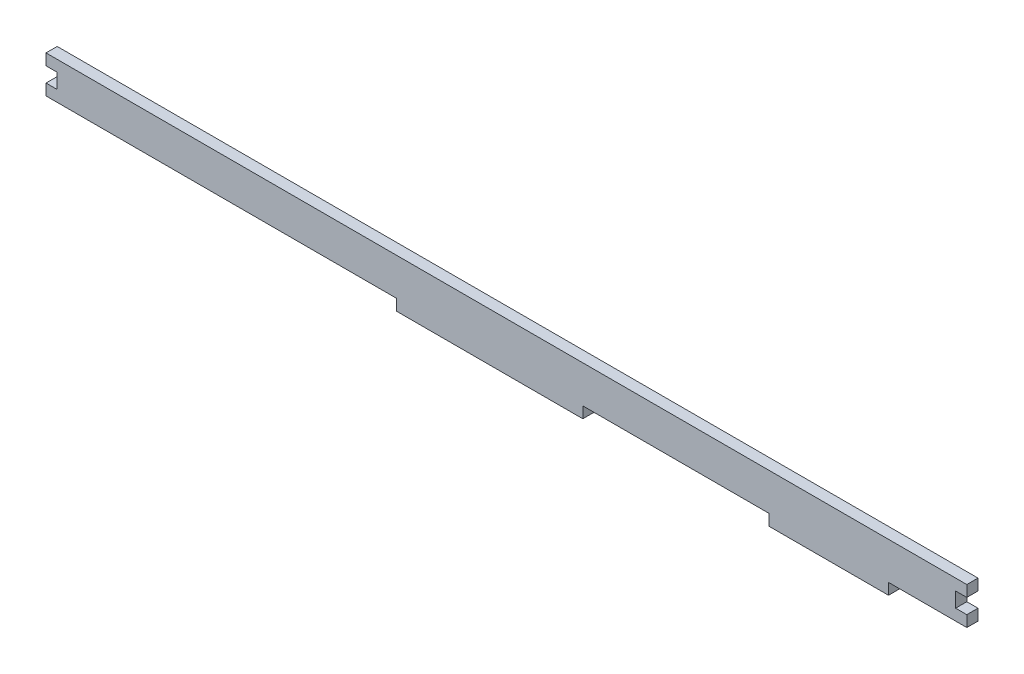
ISO-10303-21;
HEADER;
FILE_DESCRIPTION(('STEP AP214'),'2;1');
FILE_NAME('part.step','',(''),(''),'','','');
FILE_SCHEMA(('AUTOMOTIVE_DESIGN { 1 0 10303 214 1 1 1 1 }'));
ENDSEC;
DATA;
#1=APPLICATION_CONTEXT('core data for automotive mechanical design processes');
#2=APPLICATION_PROTOCOL_DEFINITION('international standard','automotive_design',2000,#1);
#3=PRODUCT_CONTEXT('',#1,'mechanical');
#4=PRODUCT('Part','Part','',(#3));
#5=PRODUCT_RELATED_PRODUCT_CATEGORY('part','',(#4));
#6=PRODUCT_DEFINITION_FORMATION('','',#4);
#7=PRODUCT_DEFINITION_CONTEXT('part definition',#1,'design');
#8=PRODUCT_DEFINITION('design','',#6,#7);
#9=PRODUCT_DEFINITION_SHAPE('','',#8);
#10=(LENGTH_UNIT() NAMED_UNIT(*) SI_UNIT(.MILLI.,.METRE.));
#11=(NAMED_UNIT(*) PLANE_ANGLE_UNIT() SI_UNIT($,.RADIAN.));
#12=(NAMED_UNIT(*) SI_UNIT($,.STERADIAN.) SOLID_ANGLE_UNIT());
#13=UNCERTAINTY_MEASURE_WITH_UNIT(LENGTH_MEASURE(1.E-05),#10,'distance_accuracy_value','');
#14=(GEOMETRIC_REPRESENTATION_CONTEXT(3) GLOBAL_UNCERTAINTY_ASSIGNED_CONTEXT((#13)) GLOBAL_UNIT_ASSIGNED_CONTEXT((#10,
#11,#12)) REPRESENTATION_CONTEXT('',''));
#15=CARTESIAN_POINT('',(0.,0.,0.));
#16=DIRECTION('',(0.,0.,1.));
#17=DIRECTION('',(1.,0.,0.));
#18=AXIS2_PLACEMENT_3D('',#15,#16,#17);
#19=CARTESIAN_POINT('',(247.,10.,3.));
#20=DIRECTION('',(-1.,0.,0.));
#21=DIRECTION('',(0.,0.,1.));
#22=AXIS2_PLACEMENT_3D('',#19,#20,#21);
#23=PLANE('',#22);
#24=DIRECTION('',(0.,1.,0.));
#25=VECTOR('',#24,1.);
#26=CARTESIAN_POINT('',(247.,10.,0.));
#27=LINE('',#26,#25);
#28=CARTESIAN_POINT('',(247.,7.,0.));
#29=VERTEX_POINT('',#28);
#30=CARTESIAN_POINT('',(247.,10.,0.));
#31=VERTEX_POINT('',#30);
#32=EDGE_CURVE('E202',#29,#31,#27,.T.);
#33=ORIENTED_EDGE('',*,*,#32,.T.);
#34=DIRECTION('',(0.,0.,-1.));
#35=VECTOR('',#34,1.);
#36=CARTESIAN_POINT('',(247.,10.,3.));
#37=LINE('',#36,#35);
#38=CARTESIAN_POINT('',(247.,10.,3.));
#39=VERTEX_POINT('',#38);
#40=EDGE_CURVE('E11',#39,#31,#37,.T.);
#41=ORIENTED_EDGE('',*,*,#40,.F.);
#42=DIRECTION('',(0.,1.,0.));
#43=VECTOR('',#42,1.);
#44=CARTESIAN_POINT('',(247.,10.,3.));
#45=LINE('',#44,#43);
#46=CARTESIAN_POINT('',(247.,7.,3.));
#47=VERTEX_POINT('',#46);
#48=EDGE_CURVE('E240',#47,#39,#45,.T.);
#49=ORIENTED_EDGE('',*,*,#48,.F.);
#50=DIRECTION('',(0.,0.,-1.));
#51=VECTOR('',#50,1.);
#52=CARTESIAN_POINT('',(247.,7.,3.));
#53=LINE('',#52,#51);
#54=EDGE_CURVE('E198',#47,#29,#53,.T.);
#55=ORIENTED_EDGE('',*,*,#54,.T.);
#56=EDGE_LOOP('',(#33,#41,#49,#55));
#57=FACE_BOUND('',#56,.T.);
#58=ADVANCED_FACE('F34',(#57),#23,.F.);
#59=CARTESIAN_POINT('',(0.,10.,3.));
#60=DIRECTION('',(0.,-1.,0.));
#61=DIRECTION('',(0.,0.,-1.));
#62=AXIS2_PLACEMENT_3D('',#59,#60,#61);
#63=PLANE('',#62);
#64=DIRECTION('',(-1.,0.,0.));
#65=VECTOR('',#64,1.);
#66=CARTESIAN_POINT('',(0.,10.,0.));
#67=LINE('',#66,#65);
#68=CARTESIAN_POINT('',(0.,10.,0.));
#69=VERTEX_POINT('',#68);
#70=EDGE_CURVE('E205',#31,#69,#67,.T.);
#71=ORIENTED_EDGE('',*,*,#70,.T.);
#72=DIRECTION('',(0.,0.,-1.));
#73=VECTOR('',#72,1.);
#74=CARTESIAN_POINT('',(0.,10.,3.));
#75=LINE('',#74,#73);
#76=CARTESIAN_POINT('',(0.,10.,3.));
#77=VERTEX_POINT('',#76);
#78=EDGE_CURVE('E42',#77,#69,#75,.T.);
#79=ORIENTED_EDGE('',*,*,#78,.F.);
#80=DIRECTION('',(-1.,0.,0.));
#81=VECTOR('',#80,1.);
#82=CARTESIAN_POINT('',(244.,10.,3.));
#83=LINE('',#82,#81);
#84=EDGE_CURVE('E129',#39,#77,#83,.T.);
#85=ORIENTED_EDGE('',*,*,#84,.F.);
#86=ORIENTED_EDGE('',*,*,#40,.T.);
#87=EDGE_LOOP('',(#71,#79,#85,#86));
#88=FACE_BOUND('',#87,.T.);
#89=ADVANCED_FACE('F358',(#88),#63,.F.);
#90=CARTESIAN_POINT('',(0.,10.,3.));
#91=DIRECTION('',(1.,0.,0.));
#92=DIRECTION('',(0.,1.,0.));
#93=AXIS2_PLACEMENT_3D('',#90,#91,#92);
#94=PLANE('',#93);
#95=DIRECTION('',(0.,-1.,0.));
#96=VECTOR('',#95,1.);
#97=CARTESIAN_POINT('',(0.,10.,0.));
#98=LINE('',#97,#96);
#99=CARTESIAN_POINT('',(0.,7.,0.));
#100=VERTEX_POINT('',#99);
#101=EDGE_CURVE('E207',#69,#100,#98,.T.);
#102=ORIENTED_EDGE('',*,*,#101,.T.);
#103=DIRECTION('',(0.,0.,-1.));
#104=VECTOR('',#103,1.);
#105=CARTESIAN_POINT('',(0.,7.,3.));
#106=LINE('',#105,#104);
#107=CARTESIAN_POINT('',(0.,7.,3.));
#108=VERTEX_POINT('',#107);
#109=EDGE_CURVE('E283',#108,#100,#106,.T.);
#110=ORIENTED_EDGE('',*,*,#109,.F.);
#111=DIRECTION('',(0.,-1.,0.));
#112=VECTOR('',#111,1.);
#113=CARTESIAN_POINT('',(0.,10.,3.));
#114=LINE('',#113,#112);
#115=EDGE_CURVE('E291',#77,#108,#114,.T.);
#116=ORIENTED_EDGE('',*,*,#115,.F.);
#117=ORIENTED_EDGE('',*,*,#78,.T.);
#118=EDGE_LOOP('',(#102,#110,#116,#117));
#119=FACE_BOUND('',#118,.T.);
#120=ADVANCED_FACE('F289',(#119),#94,.F.);
#121=CARTESIAN_POINT('',(0.,7.,3.));
#122=DIRECTION('',(0.,1.,0.));
#123=DIRECTION('',(0.,0.,1.));
#124=AXIS2_PLACEMENT_3D('',#121,#122,#123);
#125=PLANE('',#124);
#126=DIRECTION('',(1.,0.,0.));
#127=VECTOR('',#126,1.);
#128=CARTESIAN_POINT('',(0.,7.,0.));
#129=LINE('',#128,#127);
#130=CARTESIAN_POINT('',(3.,7.,0.));
#131=VERTEX_POINT('',#130);
#132=EDGE_CURVE('E209',#100,#131,#129,.T.);
#133=ORIENTED_EDGE('',*,*,#132,.T.);
#134=DIRECTION('',(0.,0.,-1.));
#135=VECTOR('',#134,1.);
#136=CARTESIAN_POINT('',(3.,7.,3.));
#137=LINE('',#136,#135);
#138=CARTESIAN_POINT('',(3.,7.,3.));
#139=VERTEX_POINT('',#138);
#140=EDGE_CURVE('E280',#139,#131,#137,.T.);
#141=ORIENTED_EDGE('',*,*,#140,.F.);
#142=DIRECTION('',(1.,0.,0.));
#143=VECTOR('',#142,1.);
#144=CARTESIAN_POINT('',(0.,7.,3.));
#145=LINE('',#144,#143);
#146=EDGE_CURVE('E309',#108,#139,#145,.T.);
#147=ORIENTED_EDGE('',*,*,#146,.F.);
#148=ORIENTED_EDGE('',*,*,#109,.T.);
#149=EDGE_LOOP('',(#133,#141,#147,#148));
#150=FACE_BOUND('',#149,.T.);
#151=ADVANCED_FACE('F300',(#150),#125,.F.);
#152=CARTESIAN_POINT('',(3.,7.,3.));
#153=DIRECTION('',(1.,0.,0.));
#154=DIRECTION('',(0.,1.,0.));
#155=AXIS2_PLACEMENT_3D('',#152,#153,#154);
#156=PLANE('',#155);
#157=DIRECTION('',(0.,-1.,0.));
#158=VECTOR('',#157,1.);
#159=CARTESIAN_POINT('',(3.,7.,0.));
#160=LINE('',#159,#158);
#161=CARTESIAN_POINT('',(3.,3.,0.));
#162=VERTEX_POINT('',#161);
#163=EDGE_CURVE('E211',#131,#162,#160,.T.);
#164=ORIENTED_EDGE('',*,*,#163,.T.);
#165=DIRECTION('',(0.,0.,-1.));
#166=VECTOR('',#165,1.);
#167=CARTESIAN_POINT('',(3.,3.,3.));
#168=LINE('',#167,#166);
#169=CARTESIAN_POINT('',(3.,3.,3.));
#170=VERTEX_POINT('',#169);
#171=EDGE_CURVE('E277',#170,#162,#168,.T.);
#172=ORIENTED_EDGE('',*,*,#171,.F.);
#173=DIRECTION('',(0.,-1.,0.));
#174=VECTOR('',#173,1.);
#175=CARTESIAN_POINT('',(3.,7.,3.));
#176=LINE('',#175,#174);
#177=EDGE_CURVE('E306',#139,#170,#176,.T.);
#178=ORIENTED_EDGE('',*,*,#177,.F.);
#179=ORIENTED_EDGE('',*,*,#140,.T.);
#180=EDGE_LOOP('',(#164,#172,#178,#179));
#181=FACE_BOUND('',#180,.T.);
#182=ADVANCED_FACE('F304',(#181),#156,.F.);
#183=CARTESIAN_POINT('',(0.,3.,3.));
#184=DIRECTION('',(0.,-1.,0.));
#185=DIRECTION('',(0.,0.,-1.));
#186=AXIS2_PLACEMENT_3D('',#183,#184,#185);
#187=PLANE('',#186);
#188=DIRECTION('',(-1.,0.,0.));
#189=VECTOR('',#188,1.);
#190=CARTESIAN_POINT('',(0.,3.,0.));
#191=LINE('',#190,#189);
#192=CARTESIAN_POINT('',(0.,3.,0.));
#193=VERTEX_POINT('',#192);
#194=EDGE_CURVE('E213',#162,#193,#191,.T.);
#195=ORIENTED_EDGE('',*,*,#194,.T.);
#196=DIRECTION('',(0.,0.,-1.));
#197=VECTOR('',#196,1.);
#198=CARTESIAN_POINT('',(0.,3.,3.));
#199=LINE('',#198,#197);
#200=CARTESIAN_POINT('',(0.,3.,3.));
#201=VERTEX_POINT('',#200);
#202=EDGE_CURVE('E274',#201,#193,#199,.T.);
#203=ORIENTED_EDGE('',*,*,#202,.F.);
#204=DIRECTION('',(-1.,0.,0.));
#205=VECTOR('',#204,1.);
#206=CARTESIAN_POINT('',(0.,3.,3.));
#207=LINE('',#206,#205);
#208=EDGE_CURVE('E308',#170,#201,#207,.T.);
#209=ORIENTED_EDGE('',*,*,#208,.F.);
#210=ORIENTED_EDGE('',*,*,#171,.T.);
#211=EDGE_LOOP('',(#195,#203,#209,#210));
#212=FACE_BOUND('',#211,.T.);
#213=ADVANCED_FACE('F371',(#212),#187,.F.);
#214=CARTESIAN_POINT('',(0.,3.,3.));
#215=DIRECTION('',(1.,0.,0.));
#216=DIRECTION('',(0.,1.,0.));
#217=AXIS2_PLACEMENT_3D('',#214,#215,#216);
#218=PLANE('',#217);
#219=DIRECTION('',(0.,-1.,0.));
#220=VECTOR('',#219,1.);
#221=CARTESIAN_POINT('',(0.,3.,0.));
#222=LINE('',#221,#220);
#223=CARTESIAN_POINT('',(0.,0.,0.));
#224=VERTEX_POINT('',#223);
#225=EDGE_CURVE('E215',#193,#224,#222,.T.);
#226=ORIENTED_EDGE('',*,*,#225,.T.);
#227=DIRECTION('',(0.,0.,-1.));
#228=VECTOR('',#227,1.);
#229=CARTESIAN_POINT('',(0.,0.,3.));
#230=LINE('',#229,#228);
#231=CARTESIAN_POINT('',(0.,0.,3.));
#232=VERTEX_POINT('',#231);
#233=EDGE_CURVE('E271',#232,#224,#230,.T.);
#234=ORIENTED_EDGE('',*,*,#233,.F.);
#235=DIRECTION('',(0.,-1.,0.));
#236=VECTOR('',#235,1.);
#237=CARTESIAN_POINT('',(0.,3.,3.));
#238=LINE('',#237,#236);
#239=EDGE_CURVE('E311',#201,#232,#238,.T.);
#240=ORIENTED_EDGE('',*,*,#239,.F.);
#241=ORIENTED_EDGE('',*,*,#202,.T.);
#242=EDGE_LOOP('',(#226,#234,#240,#241));
#243=FACE_BOUND('',#242,.T.);
#244=ADVANCED_FACE('F374',(#243),#218,.F.);
#245=CARTESIAN_POINT('',(0.,0.,3.));
#246=DIRECTION('',(0.,1.,0.));
#247=DIRECTION('',(0.,0.,1.));
#248=AXIS2_PLACEMENT_3D('',#245,#246,#247);
#249=PLANE('',#248);
#250=DIRECTION('',(1.,0.,0.));
#251=VECTOR('',#250,1.);
#252=CARTESIAN_POINT('',(0.,0.,0.));
#253=LINE('',#252,#251);
#254=CARTESIAN_POINT('',(94.,0.,0.));
#255=VERTEX_POINT('',#254);
#256=EDGE_CURVE('E217',#224,#255,#253,.T.);
#257=ORIENTED_EDGE('',*,*,#256,.T.);
#258=DIRECTION('',(0.,0.,-1.));
#259=VECTOR('',#258,1.);
#260=CARTESIAN_POINT('',(94.,0.,3.));
#261=LINE('',#260,#259);
#262=CARTESIAN_POINT('',(94.,0.,3.));
#263=VERTEX_POINT('',#262);
#264=EDGE_CURVE('E268',#263,#255,#261,.T.);
#265=ORIENTED_EDGE('',*,*,#264,.F.);
#266=DIRECTION('',(1.,0.,0.));
#267=VECTOR('',#266,1.);
#268=CARTESIAN_POINT('',(0.,0.,3.));
#269=LINE('',#268,#267);
#270=EDGE_CURVE('E317',#232,#263,#269,.T.);
#271=ORIENTED_EDGE('',*,*,#270,.F.);
#272=ORIENTED_EDGE('',*,*,#233,.T.);
#273=EDGE_LOOP('',(#257,#265,#271,#272));
#274=FACE_BOUND('',#273,.T.);
#275=ADVANCED_FACE('F378',(#274),#249,.F.);
#276=CARTESIAN_POINT('',(94.,0.,3.));
#277=DIRECTION('',(1.,0.,0.));
#278=DIRECTION('',(0.,0.,-1.));
#279=AXIS2_PLACEMENT_3D('',#276,#277,#278);
#280=PLANE('',#279);
#281=DIRECTION('',(0.,-1.,0.));
#282=VECTOR('',#281,1.);
#283=CARTESIAN_POINT('',(94.,0.,0.));
#284=LINE('',#283,#282);
#285=CARTESIAN_POINT('',(94.,-3.,0.));
#286=VERTEX_POINT('',#285);
#287=EDGE_CURVE('E219',#255,#286,#284,.T.);
#288=ORIENTED_EDGE('',*,*,#287,.T.);
#289=DIRECTION('',(0.,0.,-1.));
#290=VECTOR('',#289,1.);
#291=CARTESIAN_POINT('',(94.,-3.,3.));
#292=LINE('',#291,#290);
#293=CARTESIAN_POINT('',(94.,-3.,3.));
#294=VERTEX_POINT('',#293);
#295=EDGE_CURVE('E265',#294,#286,#292,.T.);
#296=ORIENTED_EDGE('',*,*,#295,.F.);
#297=DIRECTION('',(0.,-1.,0.));
#298=VECTOR('',#297,1.);
#299=CARTESIAN_POINT('',(94.,0.,3.));
#300=LINE('',#299,#298);
#301=EDGE_CURVE('E319',#263,#294,#300,.T.);
#302=ORIENTED_EDGE('',*,*,#301,.F.);
#303=ORIENTED_EDGE('',*,*,#264,.T.);
#304=EDGE_LOOP('',(#288,#296,#302,#303));
#305=FACE_BOUND('',#304,.T.);
#306=ADVANCED_FACE('F382',(#305),#280,.F.);
#307=CARTESIAN_POINT('',(94.,-3.,3.));
#308=DIRECTION('',(0.,1.,0.));
#309=DIRECTION('',(0.,0.,1.));
#310=AXIS2_PLACEMENT_3D('',#307,#308,#309);
#311=PLANE('',#310);
#312=DIRECTION('',(1.,0.,0.));
#313=VECTOR('',#312,1.);
#314=CARTESIAN_POINT('',(94.,-3.,0.));
#315=LINE('',#314,#313);
#316=CARTESIAN_POINT('',(144.,-3.,0.));
#317=VERTEX_POINT('',#316);
#318=EDGE_CURVE('E221',#286,#317,#315,.T.);
#319=ORIENTED_EDGE('',*,*,#318,.T.);
#320=DIRECTION('',(0.,0.,-1.));
#321=VECTOR('',#320,1.);
#322=CARTESIAN_POINT('',(144.,-3.,3.));
#323=LINE('',#322,#321);
#324=CARTESIAN_POINT('',(144.,-3.,3.));
#325=VERTEX_POINT('',#324);
#326=EDGE_CURVE('E262',#325,#317,#323,.T.);
#327=ORIENTED_EDGE('',*,*,#326,.F.);
#328=DIRECTION('',(1.,0.,0.));
#329=VECTOR('',#328,1.);
#330=CARTESIAN_POINT('',(94.,-3.,3.));
#331=LINE('',#330,#329);
#332=EDGE_CURVE('E321',#294,#325,#331,.T.);
#333=ORIENTED_EDGE('',*,*,#332,.F.);
#334=ORIENTED_EDGE('',*,*,#295,.T.);
#335=EDGE_LOOP('',(#319,#327,#333,#334));
#336=FACE_BOUND('',#335,.T.);
#337=ADVANCED_FACE('F386',(#336),#311,.F.);
#338=CARTESIAN_POINT('',(144.,0.,3.));
#339=DIRECTION('',(-1.,0.,0.));
#340=DIRECTION('',(0.,0.,1.));
#341=AXIS2_PLACEMENT_3D('',#338,#339,#340);
#342=PLANE('',#341);
#343=DIRECTION('',(0.,1.,0.));
#344=VECTOR('',#343,1.);
#345=CARTESIAN_POINT('',(144.,0.,0.));
#346=LINE('',#345,#344);
#347=CARTESIAN_POINT('',(144.,0.,0.));
#348=VERTEX_POINT('',#347);
#349=EDGE_CURVE('E223',#317,#348,#346,.T.);
#350=ORIENTED_EDGE('',*,*,#349,.T.);
#351=DIRECTION('',(0.,0.,-1.));
#352=VECTOR('',#351,1.);
#353=CARTESIAN_POINT('',(144.,0.,3.));
#354=LINE('',#353,#352);
#355=CARTESIAN_POINT('',(144.,0.,3.));
#356=VERTEX_POINT('',#355);
#357=EDGE_CURVE('E259',#356,#348,#354,.T.);
#358=ORIENTED_EDGE('',*,*,#357,.F.);
#359=DIRECTION('',(0.,1.,0.));
#360=VECTOR('',#359,1.);
#361=CARTESIAN_POINT('',(144.,0.,3.));
#362=LINE('',#361,#360);
#363=EDGE_CURVE('E323',#325,#356,#362,.T.);
#364=ORIENTED_EDGE('',*,*,#363,.F.);
#365=ORIENTED_EDGE('',*,*,#326,.T.);
#366=EDGE_LOOP('',(#350,#358,#364,#365));
#367=FACE_BOUND('',#366,.T.);
#368=ADVANCED_FACE('F390',(#367),#342,.F.);
#369=CARTESIAN_POINT('',(144.,0.,3.));
#370=DIRECTION('',(0.,1.,0.));
#371=DIRECTION('',(-1.,0.,0.));
#372=AXIS2_PLACEMENT_3D('',#369,#370,#371);
#373=PLANE('',#372);
#374=DIRECTION('',(1.,0.,0.));
#375=VECTOR('',#374,1.);
#376=CARTESIAN_POINT('',(144.,0.,0.));
#377=LINE('',#376,#375);
#378=CARTESIAN_POINT('',(194.,0.,0.));
#379=VERTEX_POINT('',#378);
#380=EDGE_CURVE('E225',#348,#379,#377,.T.);
#381=ORIENTED_EDGE('',*,*,#380,.T.);
#382=DIRECTION('',(0.,0.,-1.));
#383=VECTOR('',#382,1.);
#384=CARTESIAN_POINT('',(194.,0.,3.));
#385=LINE('',#384,#383);
#386=CARTESIAN_POINT('',(194.,0.,3.));
#387=VERTEX_POINT('',#386);
#388=EDGE_CURVE('E256',#387,#379,#385,.T.);
#389=ORIENTED_EDGE('',*,*,#388,.F.);
#390=DIRECTION('',(1.,0.,0.));
#391=VECTOR('',#390,1.);
#392=CARTESIAN_POINT('',(144.,0.,3.));
#393=LINE('',#392,#391);
#394=EDGE_CURVE('E325',#356,#387,#393,.T.);
#395=ORIENTED_EDGE('',*,*,#394,.F.);
#396=ORIENTED_EDGE('',*,*,#357,.T.);
#397=EDGE_LOOP('',(#381,#389,#395,#396));
#398=FACE_BOUND('',#397,.T.);
#399=ADVANCED_FACE('F394',(#398),#373,.F.);
#400=CARTESIAN_POINT('',(194.,0.,3.));
#401=DIRECTION('',(1.,0.,0.));
#402=DIRECTION('',(0.,0.,-1.));
#403=AXIS2_PLACEMENT_3D('',#400,#401,#402);
#404=PLANE('',#403);
#405=DIRECTION('',(0.,-1.,0.));
#406=VECTOR('',#405,1.);
#407=CARTESIAN_POINT('',(194.,0.,0.));
#408=LINE('',#407,#406);
#409=CARTESIAN_POINT('',(194.,-3.00000000000001,0.));
#410=VERTEX_POINT('',#409);
#411=EDGE_CURVE('E227',#379,#410,#408,.T.);
#412=ORIENTED_EDGE('',*,*,#411,.T.);
#413=DIRECTION('',(0.,0.,-1.));
#414=VECTOR('',#413,1.);
#415=CARTESIAN_POINT('',(194.,-3.00000000000001,3.));
#416=LINE('',#415,#414);
#417=CARTESIAN_POINT('',(194.,-3.00000000000001,3.));
#418=VERTEX_POINT('',#417);
#419=EDGE_CURVE('E253',#418,#410,#416,.T.);
#420=ORIENTED_EDGE('',*,*,#419,.F.);
#421=DIRECTION('',(0.,-1.,0.));
#422=VECTOR('',#421,1.);
#423=CARTESIAN_POINT('',(194.,0.,3.));
#424=LINE('',#423,#422);
#425=EDGE_CURVE('E327',#387,#418,#424,.T.);
#426=ORIENTED_EDGE('',*,*,#425,.F.);
#427=ORIENTED_EDGE('',*,*,#388,.T.);
#428=EDGE_LOOP('',(#412,#420,#426,#427));
#429=FACE_BOUND('',#428,.T.);
#430=ADVANCED_FACE('F398',(#429),#404,.F.);
#431=CARTESIAN_POINT('',(194.,-3.00000000000001,3.));
#432=DIRECTION('',(0.,1.,0.));
#433=DIRECTION('',(0.,0.,1.));
#434=AXIS2_PLACEMENT_3D('',#431,#432,#433);
#435=PLANE('',#434);
#436=DIRECTION('',(1.,0.,0.));
#437=VECTOR('',#436,1.);
#438=CARTESIAN_POINT('',(194.,-3.00000000000001,0.));
#439=LINE('',#438,#437);
#440=CARTESIAN_POINT('',(226.,-3.00000000000001,0.));
#441=VERTEX_POINT('',#440);
#442=EDGE_CURVE('E229',#410,#441,#439,.T.);
#443=ORIENTED_EDGE('',*,*,#442,.T.);
#444=DIRECTION('',(0.,0.,-1.));
#445=VECTOR('',#444,1.);
#446=CARTESIAN_POINT('',(226.,-3.00000000000001,3.));
#447=LINE('',#446,#445);
#448=CARTESIAN_POINT('',(226.,-3.00000000000001,3.));
#449=VERTEX_POINT('',#448);
#450=EDGE_CURVE('E250',#449,#441,#447,.T.);
#451=ORIENTED_EDGE('',*,*,#450,.F.);
#452=DIRECTION('',(1.,0.,0.));
#453=VECTOR('',#452,1.);
#454=CARTESIAN_POINT('',(194.,-3.00000000000001,3.));
#455=LINE('',#454,#453);
#456=EDGE_CURVE('E329',#418,#449,#455,.T.);
#457=ORIENTED_EDGE('',*,*,#456,.F.);
#458=ORIENTED_EDGE('',*,*,#419,.T.);
#459=EDGE_LOOP('',(#443,#451,#457,#458));
#460=FACE_BOUND('',#459,.T.);
#461=ADVANCED_FACE('F402',(#460),#435,.F.);
#462=CARTESIAN_POINT('',(226.,0.,3.));
#463=DIRECTION('',(-1.,0.,0.));
#464=DIRECTION('',(0.,0.,1.));
#465=AXIS2_PLACEMENT_3D('',#462,#463,#464);
#466=PLANE('',#465);
#467=DIRECTION('',(0.,1.,0.));
#468=VECTOR('',#467,1.);
#469=CARTESIAN_POINT('',(226.,0.,0.));
#470=LINE('',#469,#468);
#471=CARTESIAN_POINT('',(226.,0.,0.));
#472=VERTEX_POINT('',#471);
#473=EDGE_CURVE('E231',#441,#472,#470,.T.);
#474=ORIENTED_EDGE('',*,*,#473,.T.);
#475=DIRECTION('',(0.,0.,-1.));
#476=VECTOR('',#475,1.);
#477=CARTESIAN_POINT('',(226.,0.,3.));
#478=LINE('',#477,#476);
#479=CARTESIAN_POINT('',(226.,0.,3.));
#480=VERTEX_POINT('',#479);
#481=EDGE_CURVE('E247',#480,#472,#478,.T.);
#482=ORIENTED_EDGE('',*,*,#481,.F.);
#483=DIRECTION('',(0.,1.,0.));
#484=VECTOR('',#483,1.);
#485=CARTESIAN_POINT('',(226.,0.,3.));
#486=LINE('',#485,#484);
#487=EDGE_CURVE('E331',#449,#480,#486,.T.);
#488=ORIENTED_EDGE('',*,*,#487,.F.);
#489=ORIENTED_EDGE('',*,*,#450,.T.);
#490=EDGE_LOOP('',(#474,#482,#488,#489));
#491=FACE_BOUND('',#490,.T.);
#492=ADVANCED_FACE('F406',(#491),#466,.F.);
#493=CARTESIAN_POINT('',(226.,0.,3.));
#494=DIRECTION('',(0.,1.,0.));
#495=DIRECTION('',(0.,0.,1.));
#496=AXIS2_PLACEMENT_3D('',#493,#494,#495);
#497=PLANE('',#496);
#498=DIRECTION('',(1.,0.,0.));
#499=VECTOR('',#498,1.);
#500=CARTESIAN_POINT('',(226.,0.,0.));
#501=LINE('',#500,#499);
#502=CARTESIAN_POINT('',(247.,0.,0.));
#503=VERTEX_POINT('',#502);
#504=EDGE_CURVE('E233',#472,#503,#501,.T.);
#505=ORIENTED_EDGE('',*,*,#504,.T.);
#506=DIRECTION('',(0.,0.,-1.));
#507=VECTOR('',#506,1.);
#508=CARTESIAN_POINT('',(247.,0.,3.));
#509=LINE('',#508,#507);
#510=CARTESIAN_POINT('',(247.,0.,3.));
#511=VERTEX_POINT('',#510);
#512=EDGE_CURVE('E244',#511,#503,#509,.T.);
#513=ORIENTED_EDGE('',*,*,#512,.F.);
#514=DIRECTION('',(1.,0.,0.));
#515=VECTOR('',#514,1.);
#516=CARTESIAN_POINT('',(226.,0.,3.));
#517=LINE('',#516,#515);
#518=EDGE_CURVE('E333',#480,#511,#517,.T.);
#519=ORIENTED_EDGE('',*,*,#518,.F.);
#520=ORIENTED_EDGE('',*,*,#481,.T.);
#521=EDGE_LOOP('',(#505,#513,#519,#520));
#522=FACE_BOUND('',#521,.T.);
#523=ADVANCED_FACE('F339',(#522),#497,.F.);
#524=CARTESIAN_POINT('',(247.,0.,3.));
#525=DIRECTION('',(-1.,0.,0.));
#526=DIRECTION('',(0.,0.,1.));
#527=AXIS2_PLACEMENT_3D('',#524,#525,#526);
#528=PLANE('',#527);
#529=DIRECTION('',(0.,1.,0.));
#530=VECTOR('',#529,1.);
#531=CARTESIAN_POINT('',(247.,0.,0.));
#532=LINE('',#531,#530);
#533=CARTESIAN_POINT('',(247.,2.99999999999991,0.));
#534=VERTEX_POINT('',#533);
#535=EDGE_CURVE('E235',#503,#534,#532,.T.);
#536=ORIENTED_EDGE('',*,*,#535,.T.);
#537=DIRECTION('',(0.,0.,-1.));
#538=VECTOR('',#537,1.);
#539=CARTESIAN_POINT('',(247.,2.99999999999991,3.));
#540=LINE('',#539,#538);
#541=CARTESIAN_POINT('',(247.,2.99999999999991,3.));
#542=VERTEX_POINT('',#541);
#543=EDGE_CURVE('E193',#542,#534,#540,.T.);
#544=ORIENTED_EDGE('',*,*,#543,.F.);
#545=DIRECTION('',(0.,1.,0.));
#546=VECTOR('',#545,1.);
#547=CARTESIAN_POINT('',(247.,0.,3.));
#548=LINE('',#547,#546);
#549=EDGE_CURVE('E184',#511,#542,#548,.T.);
#550=ORIENTED_EDGE('',*,*,#549,.F.);
#551=ORIENTED_EDGE('',*,*,#512,.T.);
#552=EDGE_LOOP('',(#536,#544,#550,#551));
#553=FACE_BOUND('',#552,.T.);
#554=ADVANCED_FACE('F343',(#553),#528,.F.);
#555=CARTESIAN_POINT('',(244.,2.99999999999991,3.));
#556=DIRECTION('',(0.,-1.,0.));
#557=DIRECTION('',(0.,0.,-1.));
#558=AXIS2_PLACEMENT_3D('',#555,#556,#557);
#559=PLANE('',#558);
#560=DIRECTION('',(-1.,0.,0.));
#561=VECTOR('',#560,1.);
#562=CARTESIAN_POINT('',(244.,2.99999999999991,0.));
#563=LINE('',#562,#561);
#564=CARTESIAN_POINT('',(244.,2.99999999999991,0.));
#565=VERTEX_POINT('',#564);
#566=EDGE_CURVE('E192',#534,#565,#563,.T.);
#567=ORIENTED_EDGE('',*,*,#566,.T.);
#568=DIRECTION('',(0.,0.,-1.));
#569=VECTOR('',#568,1.);
#570=CARTESIAN_POINT('',(244.,2.99999999999991,3.));
#571=LINE('',#570,#569);
#572=CARTESIAN_POINT('',(244.,2.99999999999991,3.));
#573=VERTEX_POINT('',#572);
#574=EDGE_CURVE('E189',#573,#565,#571,.T.);
#575=ORIENTED_EDGE('',*,*,#574,.F.);
#576=DIRECTION('',(-1.,0.,0.));
#577=VECTOR('',#576,1.);
#578=CARTESIAN_POINT('',(244.,2.99999999999991,3.));
#579=LINE('',#578,#577);
#580=EDGE_CURVE('E178',#542,#573,#579,.T.);
#581=ORIENTED_EDGE('',*,*,#580,.F.);
#582=ORIENTED_EDGE('',*,*,#543,.T.);
#583=EDGE_LOOP('',(#567,#575,#581,#582));
#584=FACE_BOUND('',#583,.T.);
#585=ADVANCED_FACE('F190',(#584),#559,.F.);
#586=CARTESIAN_POINT('',(244.,7.,3.));
#587=DIRECTION('',(-1.,0.,0.));
#588=DIRECTION('',(0.,0.,1.));
#589=AXIS2_PLACEMENT_3D('',#586,#587,#588);
#590=PLANE('',#589);
#591=DIRECTION('',(0.,1.,0.));
#592=VECTOR('',#591,1.);
#593=CARTESIAN_POINT('',(244.,7.,0.));
#594=LINE('',#593,#592);
#595=CARTESIAN_POINT('',(244.,7.,0.));
#596=VERTEX_POINT('',#595);
#597=EDGE_CURVE('E115',#565,#596,#594,.T.);
#598=ORIENTED_EDGE('',*,*,#597,.T.);
#599=DIRECTION('',(0.,0.,-1.));
#600=VECTOR('',#599,1.);
#601=CARTESIAN_POINT('',(244.,7.,3.));
#602=LINE('',#601,#600);
#603=CARTESIAN_POINT('',(244.,7.,3.));
#604=VERTEX_POINT('',#603);
#605=EDGE_CURVE('E194',#604,#596,#602,.T.);
#606=ORIENTED_EDGE('',*,*,#605,.F.);
#607=DIRECTION('',(0.,1.,0.));
#608=VECTOR('',#607,1.);
#609=CARTESIAN_POINT('',(244.,7.,3.));
#610=LINE('',#609,#608);
#611=EDGE_CURVE('E182',#573,#604,#610,.T.);
#612=ORIENTED_EDGE('',*,*,#611,.F.);
#613=ORIENTED_EDGE('',*,*,#574,.T.);
#614=EDGE_LOOP('',(#598,#606,#612,#613));
#615=FACE_BOUND('',#614,.T.);
#616=ADVANCED_FACE('F196',(#615),#590,.F.);
#617=CARTESIAN_POINT('',(244.,7.,3.));
#618=DIRECTION('',(0.,1.,0.));
#619=DIRECTION('',(-1.,0.,0.));
#620=AXIS2_PLACEMENT_3D('',#617,#618,#619);
#621=PLANE('',#620);
#622=DIRECTION('',(1.,0.,0.));
#623=VECTOR('',#622,1.);
#624=CARTESIAN_POINT('',(244.,7.,0.));
#625=LINE('',#624,#623);
#626=EDGE_CURVE('E121',#596,#29,#625,.T.);
#627=ORIENTED_EDGE('',*,*,#626,.T.);
#628=ORIENTED_EDGE('',*,*,#54,.F.);
#629=DIRECTION('',(1.,0.,0.));
#630=VECTOR('',#629,1.);
#631=CARTESIAN_POINT('',(244.,7.,3.));
#632=LINE('',#631,#630);
#633=EDGE_CURVE('E50',#604,#47,#632,.T.);
#634=ORIENTED_EDGE('',*,*,#633,.F.);
#635=ORIENTED_EDGE('',*,*,#605,.T.);
#636=EDGE_LOOP('',(#627,#628,#634,#635));
#637=FACE_BOUND('',#636,.T.);
#638=ADVANCED_FACE('F347',(#637),#621,.F.);
#639=CARTESIAN_POINT('',(0.,0.,3.));
#640=DIRECTION('',(0.,0.,1.));
#641=DIRECTION('',(1.,0.,0.));
#642=AXIS2_PLACEMENT_3D('',#639,#640,#641);
#643=PLANE('',#642);
#644=ORIENTED_EDGE('',*,*,#48,.T.);
#645=ORIENTED_EDGE('',*,*,#84,.T.);
#646=ORIENTED_EDGE('',*,*,#115,.T.);
#647=ORIENTED_EDGE('',*,*,#146,.T.);
#648=ORIENTED_EDGE('',*,*,#177,.T.);
#649=ORIENTED_EDGE('',*,*,#208,.T.);
#650=ORIENTED_EDGE('',*,*,#239,.T.);
#651=ORIENTED_EDGE('',*,*,#270,.T.);
#652=ORIENTED_EDGE('',*,*,#301,.T.);
#653=ORIENTED_EDGE('',*,*,#332,.T.);
#654=ORIENTED_EDGE('',*,*,#363,.T.);
#655=ORIENTED_EDGE('',*,*,#394,.T.);
#656=ORIENTED_EDGE('',*,*,#425,.T.);
#657=ORIENTED_EDGE('',*,*,#456,.T.);
#658=ORIENTED_EDGE('',*,*,#487,.T.);
#659=ORIENTED_EDGE('',*,*,#518,.T.);
#660=ORIENTED_EDGE('',*,*,#549,.T.);
#661=ORIENTED_EDGE('',*,*,#580,.T.);
#662=ORIENTED_EDGE('',*,*,#611,.T.);
#663=ORIENTED_EDGE('',*,*,#633,.T.);
#664=EDGE_LOOP('',(#644,#645,#646,#647,#648,#649,#650,#651,#652,#653,#654,#655,#656,#657,#658,
#659,#660,#661,#662,#663));
#665=FACE_BOUND('',#664,.T.);
#666=ADVANCED_FACE('F180',(#665),#643,.T.);
#667=CARTESIAN_POINT('',(0.,0.,0.));
#668=DIRECTION('',(0.,0.,1.));
#669=DIRECTION('',(1.,0.,0.));
#670=AXIS2_PLACEMENT_3D('',#667,#668,#669);
#671=PLANE('',#670);
#672=ORIENTED_EDGE('',*,*,#32,.F.);
#673=ORIENTED_EDGE('',*,*,#626,.F.);
#674=ORIENTED_EDGE('',*,*,#597,.F.);
#675=ORIENTED_EDGE('',*,*,#566,.F.);
#676=ORIENTED_EDGE('',*,*,#535,.F.);
#677=ORIENTED_EDGE('',*,*,#504,.F.);
#678=ORIENTED_EDGE('',*,*,#473,.F.);
#679=ORIENTED_EDGE('',*,*,#442,.F.);
#680=ORIENTED_EDGE('',*,*,#411,.F.);
#681=ORIENTED_EDGE('',*,*,#380,.F.);
#682=ORIENTED_EDGE('',*,*,#349,.F.);
#683=ORIENTED_EDGE('',*,*,#318,.F.);
#684=ORIENTED_EDGE('',*,*,#287,.F.);
#685=ORIENTED_EDGE('',*,*,#256,.F.);
#686=ORIENTED_EDGE('',*,*,#225,.F.);
#687=ORIENTED_EDGE('',*,*,#194,.F.);
#688=ORIENTED_EDGE('',*,*,#163,.F.);
#689=ORIENTED_EDGE('',*,*,#132,.F.);
#690=ORIENTED_EDGE('',*,*,#101,.F.);
#691=ORIENTED_EDGE('',*,*,#70,.F.);
#692=EDGE_LOOP('',(#672,#673,#674,#675,#676,#677,#678,#679,#680,#681,#682,#683,#684,#685,#686,
#687,#688,#689,#690,#691));
#693=FACE_BOUND('',#692,.T.);
#694=ADVANCED_FACE('F295',(#693),#671,.F.);
#695=CLOSED_SHELL('',(#58,#89,#120,#151,#182,#213,#244,#275,#306,#337,#368,#399,#430,#461,#492,
#523,#554,#585,#616,#638,#666,#694));
#696=MANIFOLD_SOLID_BREP('B2',#695);
#697=ADVANCED_BREP_SHAPE_REPRESENTATION('',(#18,#696),#14);
#698=SHAPE_DEFINITION_REPRESENTATION(#9,#697);
ENDSEC;
END-ISO-10303-21;
